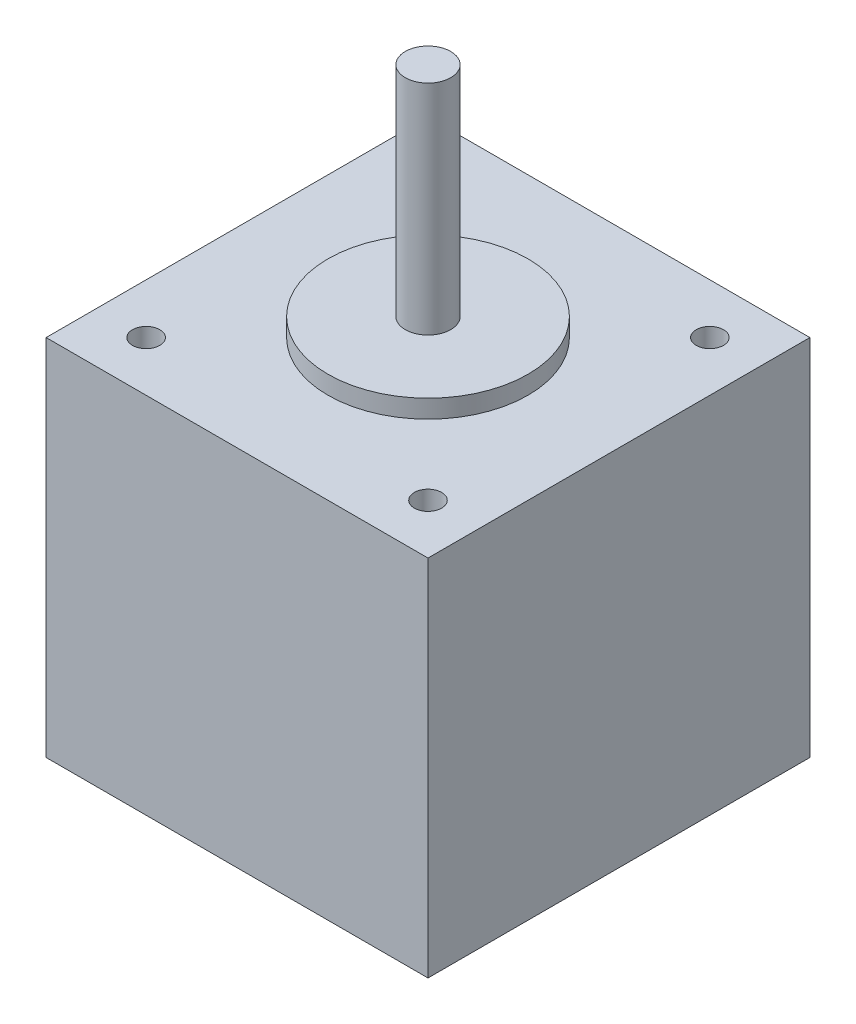
ISO-10303-21;
HEADER;
FILE_DESCRIPTION(('STEP AP214'),'2;1');
FILE_NAME('part.step','',(''),(''),'','','');
FILE_SCHEMA(('AUTOMOTIVE_DESIGN { 1 0 10303 214 1 1 1 1 }'));
ENDSEC;
DATA;
#1=APPLICATION_CONTEXT('core data for automotive mechanical design processes');
#2=APPLICATION_PROTOCOL_DEFINITION('international standard','automotive_design',2000,#1);
#3=PRODUCT_CONTEXT('',#1,'mechanical');
#4=PRODUCT('Part','Part','',(#3));
#5=PRODUCT_RELATED_PRODUCT_CATEGORY('part','',(#4));
#6=PRODUCT_DEFINITION_FORMATION('','',#4);
#7=PRODUCT_DEFINITION_CONTEXT('part definition',#1,'design');
#8=PRODUCT_DEFINITION('design','',#6,#7);
#9=PRODUCT_DEFINITION_SHAPE('','',#8);
#10=(LENGTH_UNIT() NAMED_UNIT(*) SI_UNIT(.MILLI.,.METRE.));
#11=(NAMED_UNIT(*) PLANE_ANGLE_UNIT() SI_UNIT($,.RADIAN.));
#12=(NAMED_UNIT(*) SI_UNIT($,.STERADIAN.) SOLID_ANGLE_UNIT());
#13=UNCERTAINTY_MEASURE_WITH_UNIT(LENGTH_MEASURE(1.E-05),#10,'distance_accuracy_value','');
#14=(GEOMETRIC_REPRESENTATION_CONTEXT(3) GLOBAL_UNCERTAINTY_ASSIGNED_CONTEXT((#13)) GLOBAL_UNIT_ASSIGNED_CONTEXT((#10,
#11,#12)) REPRESENTATION_CONTEXT('',''));
#15=CARTESIAN_POINT('',(0.,0.,0.));
#16=DIRECTION('',(0.,0.,1.));
#17=DIRECTION('',(1.,0.,0.));
#18=AXIS2_PLACEMENT_3D('',#15,#16,#17);
#19=CARTESIAN_POINT('',(0.,42.,0.));
#20=DIRECTION('',(0.,1.,0.));
#21=DIRECTION('',(0.,0.,1.));
#22=AXIS2_PLACEMENT_3D('',#19,#20,#21);
#23=PLANE('',#22);
#24=CARTESIAN_POINT('',(0.,42.,0.));
#25=DIRECTION('',(0.,1.,0.));
#26=DIRECTION('',(0.,0.,1.));
#27=AXIS2_PLACEMENT_3D('',#24,#25,#26);
#28=CIRCLE('',#27,11.);
#29=CARTESIAN_POINT('',(0.,42.,11.));
#30=VERTEX_POINT('',#29);
#31=EDGE_CURVE('E193',#30,#30,#28,.T.);
#32=ORIENTED_EDGE('',*,*,#31,.T.);
#33=EDGE_LOOP('',(#32));
#34=FACE_BOUND('',#33,.T.);
#35=CARTESIAN_POINT('',(0.,42.,0.));
#36=DIRECTION('',(0.,1.,0.));
#37=DIRECTION('',(0.,0.,1.));
#38=AXIS2_PLACEMENT_3D('',#35,#36,#37);
#39=CIRCLE('',#38,2.5);
#40=CARTESIAN_POINT('',(0.,42.,2.5));
#41=VERTEX_POINT('',#40);
#42=EDGE_CURVE('E200',#41,#41,#39,.T.);
#43=ORIENTED_EDGE('',*,*,#42,.F.);
#44=EDGE_LOOP('',(#43));
#45=FACE_BOUND('',#44,.T.);
#46=ADVANCED_FACE('F35',(#34,#45),#23,.T.);
#47=CARTESIAN_POINT('',(0.,40.,0.));
#48=DIRECTION('',(0.,-1.,0.));
#49=DIRECTION('',(0.,0.,-1.));
#50=AXIS2_PLACEMENT_3D('',#47,#48,#49);
#51=PLANE('',#50);
#52=DIRECTION('',(0.,0.,-1.));
#53=VECTOR('',#52,1.);
#54=CARTESIAN_POINT('',(21.,40.,21.));
#55=LINE('',#54,#53);
#56=CARTESIAN_POINT('',(21.,40.,21.));
#57=VERTEX_POINT('',#56);
#58=CARTESIAN_POINT('',(21.,40.,-21.));
#59=VERTEX_POINT('',#58);
#60=EDGE_CURVE('E89',#57,#59,#55,.T.);
#61=ORIENTED_EDGE('',*,*,#60,.T.);
#62=DIRECTION('',(-1.,0.,0.));
#63=VECTOR('',#62,1.);
#64=CARTESIAN_POINT('',(-21.,40.,-21.));
#65=LINE('',#64,#63);
#66=CARTESIAN_POINT('',(-21.,40.,-21.));
#67=VERTEX_POINT('',#66);
#68=EDGE_CURVE('E83',#59,#67,#65,.T.);
#69=ORIENTED_EDGE('',*,*,#68,.T.);
#70=DIRECTION('',(0.,0.,1.));
#71=VECTOR('',#70,1.);
#72=CARTESIAN_POINT('',(-21.,40.,21.));
#73=LINE('',#72,#71);
#74=CARTESIAN_POINT('',(-21.,40.,21.));
#75=VERTEX_POINT('',#74);
#76=EDGE_CURVE('E87',#67,#75,#73,.T.);
#77=ORIENTED_EDGE('',*,*,#76,.T.);
#78=DIRECTION('',(1.,0.,0.));
#79=VECTOR('',#78,1.);
#80=CARTESIAN_POINT('',(-21.,40.,21.));
#81=LINE('',#80,#79);
#82=EDGE_CURVE('E52',#75,#57,#81,.T.);
#83=ORIENTED_EDGE('',*,*,#82,.T.);
#84=EDGE_LOOP('',(#61,#69,#77,#83));
#85=FACE_BOUND('',#84,.T.);
#86=CARTESIAN_POINT('',(-15.5,40.,-15.5));
#87=DIRECTION('',(0.,1.,0.));
#88=DIRECTION('',(0.,0.,1.));
#89=AXIS2_PLACEMENT_3D('',#86,#87,#88);
#90=CIRCLE('',#89,1.5);
#91=CARTESIAN_POINT('',(-15.5,40.,-14.));
#92=VERTEX_POINT('',#91);
#93=EDGE_CURVE('E169',#92,#92,#90,.T.);
#94=ORIENTED_EDGE('',*,*,#93,.F.);
#95=EDGE_LOOP('',(#94));
#96=FACE_BOUND('',#95,.T.);
#97=CARTESIAN_POINT('',(15.5,40.,-15.5000000000009));
#98=DIRECTION('',(0.,1.,0.));
#99=DIRECTION('',(0.,0.,1.));
#100=AXIS2_PLACEMENT_3D('',#97,#98,#99);
#101=CIRCLE('',#100,1.50000000000091);
#102=CARTESIAN_POINT('',(15.5,40.,-14.));
#103=VERTEX_POINT('',#102);
#104=EDGE_CURVE('E165',#103,#103,#101,.T.);
#105=ORIENTED_EDGE('',*,*,#104,.F.);
#106=EDGE_LOOP('',(#105));
#107=FACE_BOUND('',#106,.T.);
#108=CARTESIAN_POINT('',(15.5000000000009,40.,15.4999999999991));
#109=DIRECTION('',(0.,1.,0.));
#110=DIRECTION('',(0.,0.,1.));
#111=AXIS2_PLACEMENT_3D('',#108,#109,#110);
#112=CIRCLE('',#111,1.50000000000123);
#113=CARTESIAN_POINT('',(15.5000000000009,40.,17.0000000000004));
#114=VERTEX_POINT('',#113);
#115=EDGE_CURVE('E172',#114,#114,#112,.T.);
#116=ORIENTED_EDGE('',*,*,#115,.F.);
#117=EDGE_LOOP('',(#116));
#118=FACE_BOUND('',#117,.T.);
#119=CARTESIAN_POINT('',(-15.4999999999991,40.,15.5));
#120=DIRECTION('',(0.,1.,0.));
#121=DIRECTION('',(0.,0.,1.));
#122=AXIS2_PLACEMENT_3D('',#119,#120,#121);
#123=CIRCLE('',#122,1.50000000000047);
#124=CARTESIAN_POINT('',(-15.4999999999991,40.,17.0000000000005));
#125=VERTEX_POINT('',#124);
#126=EDGE_CURVE('E188',#125,#125,#123,.T.);
#127=ORIENTED_EDGE('',*,*,#126,.F.);
#128=EDGE_LOOP('',(#127));
#129=FACE_BOUND('',#128,.T.);
#130=CARTESIAN_POINT('',(0.,40.,0.));
#131=DIRECTION('',(0.,-1.,0.));
#132=DIRECTION('',(0.,0.,-1.));
#133=AXIS2_PLACEMENT_3D('',#130,#131,#132);
#134=CIRCLE('',#133,11.);
#135=CARTESIAN_POINT('',(0.,40.,-11.));
#136=VERTEX_POINT('',#135);
#137=EDGE_CURVE('E11',#136,#136,#134,.F.);
#138=ORIENTED_EDGE('',*,*,#137,.F.);
#139=EDGE_LOOP('',(#138));
#140=FACE_BOUND('',#139,.T.);
#141=ADVANCED_FACE('F84',(#85,#96,#107,#118,#129,#140),#51,.F.);
#142=CARTESIAN_POINT('',(21.,40.,21.));
#143=DIRECTION('',(-1.,0.,0.));
#144=DIRECTION('',(0.,0.,1.));
#145=AXIS2_PLACEMENT_3D('',#142,#143,#144);
#146=PLANE('',#145);
#147=DIRECTION('',(0.,0.,-1.));
#148=VECTOR('',#147,1.);
#149=CARTESIAN_POINT('',(21.,0.,21.));
#150=LINE('',#149,#148);
#151=CARTESIAN_POINT('',(21.,0.,21.));
#152=VERTEX_POINT('',#151);
#153=CARTESIAN_POINT('',(21.,0.,-21.));
#154=VERTEX_POINT('',#153);
#155=EDGE_CURVE('E103',#152,#154,#150,.T.);
#156=ORIENTED_EDGE('',*,*,#155,.T.);
#157=DIRECTION('',(0.,-1.,0.));
#158=VECTOR('',#157,1.);
#159=CARTESIAN_POINT('',(21.,40.,-21.));
#160=LINE('',#159,#158);
#161=EDGE_CURVE('E44',#59,#154,#160,.T.);
#162=ORIENTED_EDGE('',*,*,#161,.F.);
#163=ORIENTED_EDGE('',*,*,#60,.F.);
#164=DIRECTION('',(0.,-1.,0.));
#165=VECTOR('',#164,1.);
#166=CARTESIAN_POINT('',(21.,40.,21.));
#167=LINE('',#166,#165);
#168=EDGE_CURVE('E99',#57,#152,#167,.T.);
#169=ORIENTED_EDGE('',*,*,#168,.T.);
#170=EDGE_LOOP('',(#156,#162,#163,#169));
#171=FACE_BOUND('',#170,.T.);
#172=ADVANCED_FACE('F37',(#171),#146,.F.);
#173=CARTESIAN_POINT('',(-21.,40.,-21.));
#174=DIRECTION('',(0.,0.,1.));
#175=DIRECTION('',(1.,0.,0.));
#176=AXIS2_PLACEMENT_3D('',#173,#174,#175);
#177=PLANE('',#176);
#178=DIRECTION('',(-1.,0.,0.));
#179=VECTOR('',#178,1.);
#180=CARTESIAN_POINT('',(-21.,0.,-21.));
#181=LINE('',#180,#179);
#182=CARTESIAN_POINT('',(-21.,0.,-21.));
#183=VERTEX_POINT('',#182);
#184=EDGE_CURVE('E94',#154,#183,#181,.T.);
#185=ORIENTED_EDGE('',*,*,#184,.T.);
#186=DIRECTION('',(0.,-1.,0.));
#187=VECTOR('',#186,1.);
#188=CARTESIAN_POINT('',(-21.,40.,-21.));
#189=LINE('',#188,#187);
#190=EDGE_CURVE('E92',#67,#183,#189,.T.);
#191=ORIENTED_EDGE('',*,*,#190,.F.);
#192=ORIENTED_EDGE('',*,*,#68,.F.);
#193=ORIENTED_EDGE('',*,*,#161,.T.);
#194=EDGE_LOOP('',(#185,#191,#192,#193));
#195=FACE_BOUND('',#194,.T.);
#196=ADVANCED_FACE('F93',(#195),#177,.F.);
#197=CARTESIAN_POINT('',(-21.,40.,21.));
#198=DIRECTION('',(1.,0.,0.));
#199=DIRECTION('',(0.,0.,-1.));
#200=AXIS2_PLACEMENT_3D('',#197,#198,#199);
#201=PLANE('',#200);
#202=DIRECTION('',(0.,0.,1.));
#203=VECTOR('',#202,1.);
#204=CARTESIAN_POINT('',(-21.,0.,21.));
#205=LINE('',#204,#203);
#206=CARTESIAN_POINT('',(-21.,0.,21.));
#207=VERTEX_POINT('',#206);
#208=EDGE_CURVE('E69',#183,#207,#205,.T.);
#209=ORIENTED_EDGE('',*,*,#208,.T.);
#210=DIRECTION('',(0.,-1.,0.));
#211=VECTOR('',#210,1.);
#212=CARTESIAN_POINT('',(-21.,40.,21.));
#213=LINE('',#212,#211);
#214=EDGE_CURVE('E95',#75,#207,#213,.T.);
#215=ORIENTED_EDGE('',*,*,#214,.F.);
#216=ORIENTED_EDGE('',*,*,#76,.F.);
#217=ORIENTED_EDGE('',*,*,#190,.T.);
#218=EDGE_LOOP('',(#209,#215,#216,#217));
#219=FACE_BOUND('',#218,.T.);
#220=ADVANCED_FACE('F97',(#219),#201,.F.);
#221=CARTESIAN_POINT('',(-21.,40.,21.));
#222=DIRECTION('',(0.,0.,-1.));
#223=DIRECTION('',(-1.,0.,0.));
#224=AXIS2_PLACEMENT_3D('',#221,#222,#223);
#225=PLANE('',#224);
#226=DIRECTION('',(1.,0.,0.));
#227=VECTOR('',#226,1.);
#228=CARTESIAN_POINT('',(-21.,0.,21.));
#229=LINE('',#228,#227);
#230=EDGE_CURVE('E75',#207,#152,#229,.T.);
#231=ORIENTED_EDGE('',*,*,#230,.T.);
#232=ORIENTED_EDGE('',*,*,#168,.F.);
#233=ORIENTED_EDGE('',*,*,#82,.F.);
#234=ORIENTED_EDGE('',*,*,#214,.T.);
#235=EDGE_LOOP('',(#231,#232,#233,#234));
#236=FACE_BOUND('',#235,.T.);
#237=ADVANCED_FACE('F117',(#236),#225,.F.);
#238=CARTESIAN_POINT('',(0.,0.,0.));
#239=DIRECTION('',(0.,-1.,0.));
#240=DIRECTION('',(0.,0.,-1.));
#241=AXIS2_PLACEMENT_3D('',#238,#239,#240);
#242=PLANE('',#241);
#243=CARTESIAN_POINT('',(-15.4999999999991,0.,15.5));
#244=DIRECTION('',(0.,1.,0.));
#245=DIRECTION('',(0.,0.,1.));
#246=AXIS2_PLACEMENT_3D('',#243,#244,#245);
#247=CIRCLE('',#246,1.50000000000047);
#248=CARTESIAN_POINT('',(-15.4999999999991,0.,17.0000000000005));
#249=VERTEX_POINT('',#248);
#250=EDGE_CURVE('E192',#249,#249,#247,.T.);
#251=ORIENTED_EDGE('',*,*,#250,.T.);
#252=EDGE_LOOP('',(#251));
#253=FACE_BOUND('',#252,.T.);
#254=CARTESIAN_POINT('',(15.5000000000009,0.,15.4999999999991));
#255=DIRECTION('',(0.,1.,0.));
#256=DIRECTION('',(0.,0.,1.));
#257=AXIS2_PLACEMENT_3D('',#254,#255,#256);
#258=CIRCLE('',#257,1.50000000000123);
#259=CARTESIAN_POINT('',(15.5000000000009,0.,17.0000000000004));
#260=VERTEX_POINT('',#259);
#261=EDGE_CURVE('E167',#260,#260,#258,.T.);
#262=ORIENTED_EDGE('',*,*,#261,.T.);
#263=EDGE_LOOP('',(#262));
#264=FACE_BOUND('',#263,.T.);
#265=CARTESIAN_POINT('',(15.5,0.,-15.5000000000009));
#266=DIRECTION('',(0.,1.,0.));
#267=DIRECTION('',(0.,0.,1.));
#268=AXIS2_PLACEMENT_3D('',#265,#266,#267);
#269=CIRCLE('',#268,1.50000000000091);
#270=CARTESIAN_POINT('',(15.5,0.,-14.));
#271=VERTEX_POINT('',#270);
#272=EDGE_CURVE('E162',#271,#271,#269,.T.);
#273=ORIENTED_EDGE('',*,*,#272,.T.);
#274=EDGE_LOOP('',(#273));
#275=FACE_BOUND('',#274,.T.);
#276=CARTESIAN_POINT('',(-15.5,0.,-15.5));
#277=DIRECTION('',(0.,1.,0.));
#278=DIRECTION('',(0.,0.,1.));
#279=AXIS2_PLACEMENT_3D('',#276,#277,#278);
#280=CIRCLE('',#279,1.5);
#281=CARTESIAN_POINT('',(-15.5,0.,-14.));
#282=VERTEX_POINT('',#281);
#283=EDGE_CURVE('E106',#282,#282,#280,.T.);
#284=ORIENTED_EDGE('',*,*,#283,.T.);
#285=EDGE_LOOP('',(#284));
#286=FACE_BOUND('',#285,.T.);
#287=ORIENTED_EDGE('',*,*,#155,.F.);
#288=ORIENTED_EDGE('',*,*,#230,.F.);
#289=ORIENTED_EDGE('',*,*,#208,.F.);
#290=ORIENTED_EDGE('',*,*,#184,.F.);
#291=EDGE_LOOP('',(#287,#288,#289,#290));
#292=FACE_BOUND('',#291,.T.);
#293=ADVANCED_FACE('F114',(#253,#264,#275,#286,#292),#242,.T.);
#294=CARTESIAN_POINT('',(-15.5,0.,-15.5));
#295=DIRECTION('',(0.,1.,0.));
#296=DIRECTION('',(0.,0.,1.));
#297=AXIS2_PLACEMENT_3D('',#294,#295,#296);
#298=CYLINDRICAL_SURFACE('',#297,1.5);
#299=ORIENTED_EDGE('',*,*,#283,.F.);
#300=EDGE_LOOP('',(#299));
#301=FACE_BOUND('',#300,.T.);
#302=ORIENTED_EDGE('',*,*,#93,.T.);
#303=EDGE_LOOP('',(#302));
#304=FACE_BOUND('',#303,.T.);
#305=ADVANCED_FACE('F116',(#301,#304),#298,.F.);
#306=CARTESIAN_POINT('',(15.5,0.,-15.5000000000009));
#307=DIRECTION('',(0.,1.,0.));
#308=DIRECTION('',(0.,0.,1.));
#309=AXIS2_PLACEMENT_3D('',#306,#307,#308);
#310=CYLINDRICAL_SURFACE('',#309,1.50000000000091);
#311=ORIENTED_EDGE('',*,*,#272,.F.);
#312=EDGE_LOOP('',(#311));
#313=FACE_BOUND('',#312,.T.);
#314=ORIENTED_EDGE('',*,*,#104,.T.);
#315=EDGE_LOOP('',(#314));
#316=FACE_BOUND('',#315,.T.);
#317=ADVANCED_FACE('F124',(#313,#316),#310,.F.);
#318=CARTESIAN_POINT('',(15.5000000000009,0.,15.4999999999991));
#319=DIRECTION('',(0.,1.,0.));
#320=DIRECTION('',(0.,0.,1.));
#321=AXIS2_PLACEMENT_3D('',#318,#319,#320);
#322=CYLINDRICAL_SURFACE('',#321,1.50000000000123);
#323=ORIENTED_EDGE('',*,*,#261,.F.);
#324=EDGE_LOOP('',(#323));
#325=FACE_BOUND('',#324,.T.);
#326=ORIENTED_EDGE('',*,*,#115,.T.);
#327=EDGE_LOOP('',(#326));
#328=FACE_BOUND('',#327,.T.);
#329=ADVANCED_FACE('F150',(#325,#328),#322,.F.);
#330=CARTESIAN_POINT('',(-15.4999999999991,0.,15.5));
#331=DIRECTION('',(0.,1.,0.));
#332=DIRECTION('',(0.,0.,1.));
#333=AXIS2_PLACEMENT_3D('',#330,#331,#332);
#334=CYLINDRICAL_SURFACE('',#333,1.50000000000047);
#335=ORIENTED_EDGE('',*,*,#250,.F.);
#336=EDGE_LOOP('',(#335));
#337=FACE_BOUND('',#336,.T.);
#338=ORIENTED_EDGE('',*,*,#126,.T.);
#339=EDGE_LOOP('',(#338));
#340=FACE_BOUND('',#339,.T.);
#341=ADVANCED_FACE('F146',(#337,#340),#334,.F.);
#342=CARTESIAN_POINT('',(0.,42.,0.));
#343=DIRECTION('',(0.,-1.,0.));
#344=DIRECTION('',(0.,0.,-1.));
#345=AXIS2_PLACEMENT_3D('',#342,#343,#344);
#346=CYLINDRICAL_SURFACE('',#345,11.);
#347=ORIENTED_EDGE('',*,*,#31,.F.);
#348=EDGE_LOOP('',(#347));
#349=FACE_BOUND('',#348,.T.);
#350=ORIENTED_EDGE('',*,*,#137,.T.);
#351=EDGE_LOOP('',(#350));
#352=FACE_BOUND('',#351,.T.);
#353=ADVANCED_FACE('F143',(#349,#352),#346,.T.);
#354=CARTESIAN_POINT('',(0.,66.,0.));
#355=DIRECTION('',(0.,-1.,0.));
#356=DIRECTION('',(0.,0.,-1.));
#357=AXIS2_PLACEMENT_3D('',#354,#355,#356);
#358=CYLINDRICAL_SURFACE('',#357,2.5);
#359=CARTESIAN_POINT('',(0.,66.,0.));
#360=DIRECTION('',(0.,1.,0.));
#361=DIRECTION('',(0.,0.,1.));
#362=AXIS2_PLACEMENT_3D('',#359,#360,#361);
#363=CIRCLE('',#362,2.5);
#364=CARTESIAN_POINT('',(0.,66.,2.5));
#365=VERTEX_POINT('',#364);
#366=EDGE_CURVE('E196',#365,#365,#363,.T.);
#367=ORIENTED_EDGE('',*,*,#366,.F.);
#368=EDGE_LOOP('',(#367));
#369=FACE_BOUND('',#368,.T.);
#370=ORIENTED_EDGE('',*,*,#42,.T.);
#371=EDGE_LOOP('',(#370));
#372=FACE_BOUND('',#371,.T.);
#373=ADVANCED_FACE('F141',(#369,#372),#358,.T.);
#374=CARTESIAN_POINT('',(0.,66.,0.));
#375=DIRECTION('',(0.,1.,0.));
#376=DIRECTION('',(0.,0.,1.));
#377=AXIS2_PLACEMENT_3D('',#374,#375,#376);
#378=PLANE('',#377);
#379=ORIENTED_EDGE('',*,*,#366,.T.);
#380=EDGE_LOOP('',(#379));
#381=FACE_BOUND('',#380,.T.);
#382=ADVANCED_FACE('F206',(#381),#378,.T.);
#383=CLOSED_SHELL('',(#46,#141,#172,#196,#220,#237,#293,#305,#317,#329,#341,#353,#373,#382));
#384=MANIFOLD_SOLID_BREP('B2',#383);
#385=ADVANCED_BREP_SHAPE_REPRESENTATION('',(#18,#384),#14);
#386=SHAPE_DEFINITION_REPRESENTATION(#9,#385);
ENDSEC;
END-ISO-10303-21;
